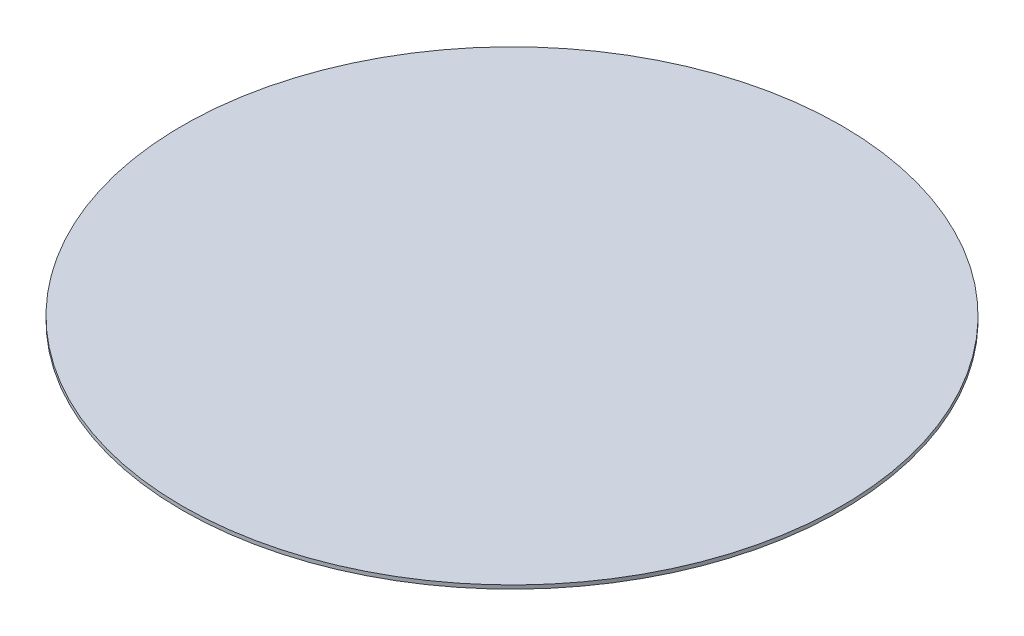
ISO-10303-21;
HEADER;
FILE_DESCRIPTION(('STEP AP214'),'2;1');
FILE_NAME('part.step','',(''),(''),'','','');
FILE_SCHEMA(('AUTOMOTIVE_DESIGN { 1 0 10303 214 1 1 1 1 }'));
ENDSEC;
DATA;
#1=APPLICATION_CONTEXT('core data for automotive mechanical design processes');
#2=APPLICATION_PROTOCOL_DEFINITION('international standard','automotive_design',2000,#1);
#3=PRODUCT_CONTEXT('',#1,'mechanical');
#4=PRODUCT('Part','Part','',(#3));
#5=PRODUCT_RELATED_PRODUCT_CATEGORY('part','',(#4));
#6=PRODUCT_DEFINITION_FORMATION('','',#4);
#7=PRODUCT_DEFINITION_CONTEXT('part definition',#1,'design');
#8=PRODUCT_DEFINITION('design','',#6,#7);
#9=PRODUCT_DEFINITION_SHAPE('','',#8);
#10=(LENGTH_UNIT() NAMED_UNIT(*) SI_UNIT(.MILLI.,.METRE.));
#11=(NAMED_UNIT(*) PLANE_ANGLE_UNIT() SI_UNIT($,.RADIAN.));
#12=(NAMED_UNIT(*) SI_UNIT($,.STERADIAN.) SOLID_ANGLE_UNIT());
#13=UNCERTAINTY_MEASURE_WITH_UNIT(LENGTH_MEASURE(1.E-05),#10,'distance_accuracy_value','');
#14=(GEOMETRIC_REPRESENTATION_CONTEXT(3) GLOBAL_UNCERTAINTY_ASSIGNED_CONTEXT((#13)) GLOBAL_UNIT_ASSIGNED_CONTEXT((#10,
#11,#12)) REPRESENTATION_CONTEXT('',''));
#15=CARTESIAN_POINT('',(0.,0.,0.));
#16=DIRECTION('',(0.,0.,1.));
#17=DIRECTION('',(1.,0.,0.));
#18=AXIS2_PLACEMENT_3D('',#15,#16,#17);
#19=CARTESIAN_POINT('',(0.,0.635,0.));
#20=DIRECTION('',(0.,-1.,0.));
#21=DIRECTION('',(0.,0.,-1.));
#22=AXIS2_PLACEMENT_3D('',#19,#20,#21);
#23=CYLINDRICAL_SURFACE('',#22,57.15);
#24=CARTESIAN_POINT('',(0.,0.635,0.));
#25=DIRECTION('',(0.,1.,0.));
#26=DIRECTION('',(0.,0.,1.));
#27=AXIS2_PLACEMENT_3D('',#24,#25,#26);
#28=CIRCLE('',#27,57.15);
#29=CARTESIAN_POINT('',(0.,0.635,57.15));
#30=VERTEX_POINT('',#29);
#31=EDGE_CURVE('E10',#30,#30,#28,.T.);
#32=ORIENTED_EDGE('',*,*,#31,.F.);
#33=EDGE_LOOP('',(#32));
#34=FACE_BOUND('',#33,.T.);
#35=CARTESIAN_POINT('',(0.,0.,0.));
#36=DIRECTION('',(0.,1.,0.));
#37=DIRECTION('',(0.,0.,1.));
#38=AXIS2_PLACEMENT_3D('',#35,#36,#37);
#39=CIRCLE('',#38,57.15);
#40=CARTESIAN_POINT('',(0.,0.,57.15));
#41=VERTEX_POINT('',#40);
#42=EDGE_CURVE('E40',#41,#41,#39,.T.);
#43=ORIENTED_EDGE('',*,*,#42,.T.);
#44=EDGE_LOOP('',(#43));
#45=FACE_BOUND('',#44,.T.);
#46=ADVANCED_FACE('F37',(#34,#45),#23,.T.);
#47=CARTESIAN_POINT('',(0.,0.635,0.));
#48=DIRECTION('',(0.,1.,0.));
#49=DIRECTION('',(0.,0.,1.));
#50=AXIS2_PLACEMENT_3D('',#47,#48,#49);
#51=PLANE('',#50);
#52=ORIENTED_EDGE('',*,*,#31,.T.);
#53=EDGE_LOOP('',(#52));
#54=FACE_BOUND('',#53,.T.);
#55=ADVANCED_FACE('F52',(#54),#51,.T.);
#56=CARTESIAN_POINT('',(0.,0.,0.));
#57=DIRECTION('',(0.,1.,0.));
#58=DIRECTION('',(0.,0.,1.));
#59=AXIS2_PLACEMENT_3D('',#56,#57,#58);
#60=PLANE('',#59);
#61=ORIENTED_EDGE('',*,*,#42,.F.);
#62=EDGE_LOOP('',(#61));
#63=FACE_BOUND('',#62,.T.);
#64=ADVANCED_FACE('F50',(#63),#60,.F.);
#65=CLOSED_SHELL('',(#46,#55,#64));
#66=MANIFOLD_SOLID_BREP('B2',#65);
#67=ADVANCED_BREP_SHAPE_REPRESENTATION('',(#18,#66),#14);
#68=SHAPE_DEFINITION_REPRESENTATION(#9,#67);
ENDSEC;
END-ISO-10303-21;
